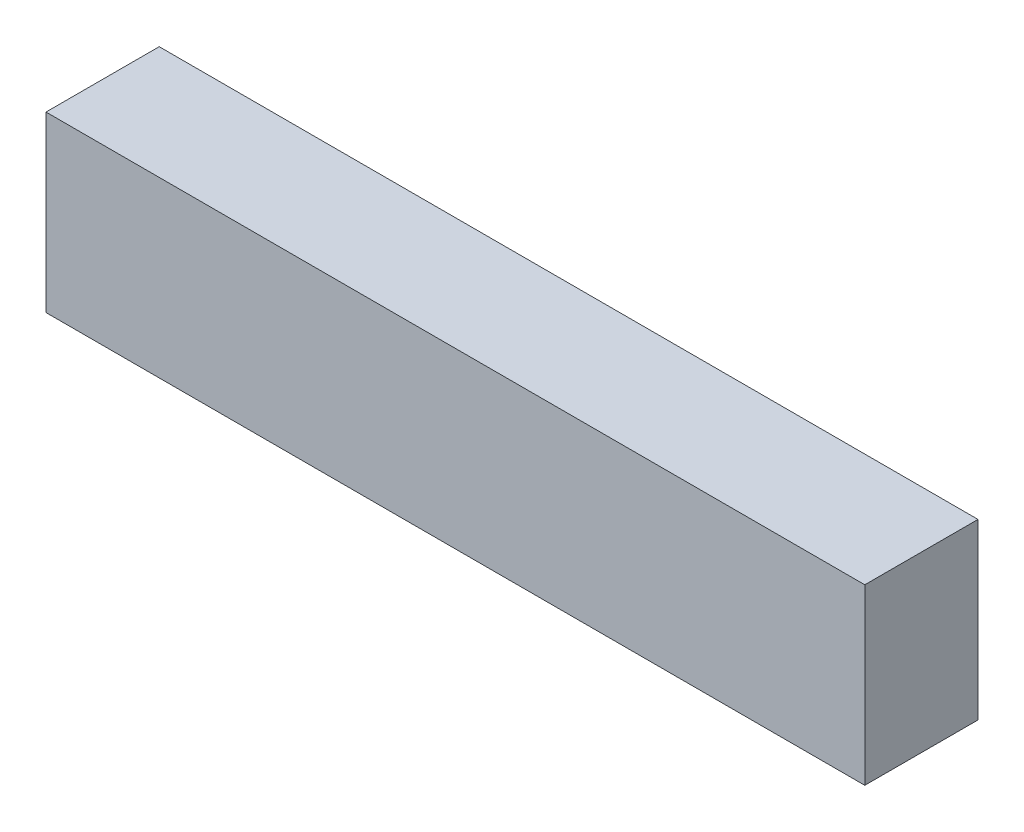
ISO-10303-21;
HEADER;
FILE_DESCRIPTION(('STEP AP214'),'2;1');
FILE_NAME('part.step','',(''),(''),'','','');
FILE_SCHEMA(('AUTOMOTIVE_DESIGN { 1 0 10303 214 1 1 1 1 }'));
ENDSEC;
DATA;
#1=APPLICATION_CONTEXT('core data for automotive mechanical design processes');
#2=APPLICATION_PROTOCOL_DEFINITION('international standard','automotive_design',2000,#1);
#3=PRODUCT_CONTEXT('',#1,'mechanical');
#4=PRODUCT('Part','Part','',(#3));
#5=PRODUCT_RELATED_PRODUCT_CATEGORY('part','',(#4));
#6=PRODUCT_DEFINITION_FORMATION('','',#4);
#7=PRODUCT_DEFINITION_CONTEXT('part definition',#1,'design');
#8=PRODUCT_DEFINITION('design','',#6,#7);
#9=PRODUCT_DEFINITION_SHAPE('','',#8);
#10=(LENGTH_UNIT() NAMED_UNIT(*) SI_UNIT(.MILLI.,.METRE.));
#11=(NAMED_UNIT(*) PLANE_ANGLE_UNIT() SI_UNIT($,.RADIAN.));
#12=(NAMED_UNIT(*) SI_UNIT($,.STERADIAN.) SOLID_ANGLE_UNIT());
#13=UNCERTAINTY_MEASURE_WITH_UNIT(LENGTH_MEASURE(1.E-05),#10,'distance_accuracy_value','');
#14=(GEOMETRIC_REPRESENTATION_CONTEXT(3) GLOBAL_UNCERTAINTY_ASSIGNED_CONTEXT((#13)) GLOBAL_UNIT_ASSIGNED_CONTEXT((#10,
#11,#12)) REPRESENTATION_CONTEXT('',''));
#15=CARTESIAN_POINT('',(0.,0.,0.));
#16=DIRECTION('',(0.,0.,1.));
#17=DIRECTION('',(1.,0.,0.));
#18=AXIS2_PLACEMENT_3D('',#15,#16,#17);
#19=CARTESIAN_POINT('',(0.,0.,85.));
#20=DIRECTION('',(0.,0.,1.));
#21=DIRECTION('',(1.,0.,0.));
#22=AXIS2_PLACEMENT_3D('',#19,#20,#21);
#23=PLANE('',#22);
#24=DIRECTION('',(-1.,0.,0.));
#25=VECTOR('',#24,1.);
#26=CARTESIAN_POINT('',(0.,-56.,85.));
#27=LINE('',#26,#25);
#28=CARTESIAN_POINT('',(264.,-56.,85.));
#29=VERTEX_POINT('',#28);
#30=CARTESIAN_POINT('',(-264.,-56.,85.));
#31=VERTEX_POINT('',#30);
#32=EDGE_CURVE('E11',#29,#31,#27,.T.);
#33=ORIENTED_EDGE('',*,*,#32,.F.);
#34=DIRECTION('',(0.,-1.,0.));
#35=VECTOR('',#34,1.);
#36=CARTESIAN_POINT('',(264.,0.,85.));
#37=LINE('',#36,#35);
#38=CARTESIAN_POINT('',(264.,56.,85.));
#39=VERTEX_POINT('',#38);
#40=EDGE_CURVE('E62',#39,#29,#37,.T.);
#41=ORIENTED_EDGE('',*,*,#40,.F.);
#42=DIRECTION('',(1.,0.,0.));
#43=VECTOR('',#42,1.);
#44=CARTESIAN_POINT('',(0.,56.,85.));
#45=LINE('',#44,#43);
#46=CARTESIAN_POINT('',(-264.,56.,85.));
#47=VERTEX_POINT('',#46);
#48=EDGE_CURVE('E99',#47,#39,#45,.T.);
#49=ORIENTED_EDGE('',*,*,#48,.F.);
#50=DIRECTION('',(0.,1.,0.));
#51=VECTOR('',#50,1.);
#52=CARTESIAN_POINT('',(-264.,0.,85.));
#53=LINE('',#52,#51);
#54=EDGE_CURVE('E25',#31,#47,#53,.T.);
#55=ORIENTED_EDGE('',*,*,#54,.F.);
#56=EDGE_LOOP('',(#33,#41,#49,#55));
#57=FACE_BOUND('',#56,.T.);
#58=ADVANCED_FACE('F17',(#57),#23,.T.);
#59=CARTESIAN_POINT('',(0.,-56.,12.));
#60=DIRECTION('',(0.,-1.,0.));
#61=DIRECTION('',(0.,0.,-1.));
#62=AXIS2_PLACEMENT_3D('',#59,#60,#61);
#63=PLANE('',#62);
#64=DIRECTION('',(0.,0.,1.));
#65=VECTOR('',#64,1.);
#66=CARTESIAN_POINT('',(264.,-56.,12.));
#67=LINE('',#66,#65);
#68=CARTESIAN_POINT('',(264.,-56.,12.));
#69=VERTEX_POINT('',#68);
#70=EDGE_CURVE('E55',#69,#29,#67,.T.);
#71=ORIENTED_EDGE('',*,*,#70,.T.);
#72=ORIENTED_EDGE('',*,*,#32,.T.);
#73=DIRECTION('',(0.,0.,1.));
#74=VECTOR('',#73,1.);
#75=CARTESIAN_POINT('',(-264.,-56.,12.));
#76=LINE('',#75,#74);
#77=CARTESIAN_POINT('',(-264.,-56.,12.));
#78=VERTEX_POINT('',#77);
#79=EDGE_CURVE('E69',#78,#31,#76,.T.);
#80=ORIENTED_EDGE('',*,*,#79,.F.);
#81=DIRECTION('',(1.,0.,0.));
#82=VECTOR('',#81,1.);
#83=CARTESIAN_POINT('',(0.,-56.,12.));
#84=LINE('',#83,#82);
#85=EDGE_CURVE('E67',#78,#69,#84,.T.);
#86=ORIENTED_EDGE('',*,*,#85,.T.);
#87=EDGE_LOOP('',(#71,#72,#80,#86));
#88=FACE_BOUND('',#87,.T.);
#89=ADVANCED_FACE('F68',(#88),#63,.T.);
#90=CARTESIAN_POINT('',(-264.,0.,12.));
#91=DIRECTION('',(-1.,0.,0.));
#92=DIRECTION('',(0.,0.,1.));
#93=AXIS2_PLACEMENT_3D('',#90,#91,#92);
#94=PLANE('',#93);
#95=ORIENTED_EDGE('',*,*,#79,.T.);
#96=ORIENTED_EDGE('',*,*,#54,.T.);
#97=DIRECTION('',(0.,0.,1.));
#98=VECTOR('',#97,1.);
#99=CARTESIAN_POINT('',(-264.,56.,12.));
#100=LINE('',#99,#98);
#101=CARTESIAN_POINT('',(-264.,56.,12.));
#102=VERTEX_POINT('',#101);
#103=EDGE_CURVE('E91',#102,#47,#100,.T.);
#104=ORIENTED_EDGE('',*,*,#103,.F.);
#105=DIRECTION('',(0.,-1.,0.));
#106=VECTOR('',#105,1.);
#107=CARTESIAN_POINT('',(-264.,0.,12.));
#108=LINE('',#107,#106);
#109=EDGE_CURVE('E74',#102,#78,#108,.T.);
#110=ORIENTED_EDGE('',*,*,#109,.T.);
#111=EDGE_LOOP('',(#95,#96,#104,#110));
#112=FACE_BOUND('',#111,.T.);
#113=ADVANCED_FACE('F106',(#112),#94,.T.);
#114=CARTESIAN_POINT('',(0.,56.,12.));
#115=DIRECTION('',(0.,1.,0.));
#116=DIRECTION('',(0.,0.,1.));
#117=AXIS2_PLACEMENT_3D('',#114,#115,#116);
#118=PLANE('',#117);
#119=ORIENTED_EDGE('',*,*,#103,.T.);
#120=ORIENTED_EDGE('',*,*,#48,.T.);
#121=DIRECTION('',(0.,0.,1.));
#122=VECTOR('',#121,1.);
#123=CARTESIAN_POINT('',(264.,56.,12.));
#124=LINE('',#123,#122);
#125=CARTESIAN_POINT('',(264.,56.,12.));
#126=VERTEX_POINT('',#125);
#127=EDGE_CURVE('E64',#126,#39,#124,.T.);
#128=ORIENTED_EDGE('',*,*,#127,.F.);
#129=DIRECTION('',(-1.,0.,0.));
#130=VECTOR('',#129,1.);
#131=CARTESIAN_POINT('',(0.,56.,12.));
#132=LINE('',#131,#130);
#133=EDGE_CURVE('E79',#126,#102,#132,.T.);
#134=ORIENTED_EDGE('',*,*,#133,.T.);
#135=EDGE_LOOP('',(#119,#120,#128,#134));
#136=FACE_BOUND('',#135,.T.);
#137=ADVANCED_FACE('F104',(#136),#118,.T.);
#138=CARTESIAN_POINT('',(0.,0.,12.));
#139=DIRECTION('',(0.,0.,-1.));
#140=DIRECTION('',(-1.,0.,0.));
#141=AXIS2_PLACEMENT_3D('',#138,#139,#140);
#142=PLANE('',#141);
#143=DIRECTION('',(0.,1.,0.));
#144=VECTOR('',#143,1.);
#145=CARTESIAN_POINT('',(264.,0.,12.));
#146=LINE('',#145,#144);
#147=EDGE_CURVE('E60',#69,#126,#146,.T.);
#148=ORIENTED_EDGE('',*,*,#147,.F.);
#149=ORIENTED_EDGE('',*,*,#85,.F.);
#150=ORIENTED_EDGE('',*,*,#109,.F.);
#151=ORIENTED_EDGE('',*,*,#133,.F.);
#152=EDGE_LOOP('',(#148,#149,#150,#151));
#153=FACE_BOUND('',#152,.T.);
#154=ADVANCED_FACE('F77',(#153),#142,.T.);
#155=CARTESIAN_POINT('',(264.,0.,12.));
#156=DIRECTION('',(1.,0.,0.));
#157=DIRECTION('',(0.,0.,-1.));
#158=AXIS2_PLACEMENT_3D('',#155,#156,#157);
#159=PLANE('',#158);
#160=ORIENTED_EDGE('',*,*,#147,.T.);
#161=ORIENTED_EDGE('',*,*,#127,.T.);
#162=ORIENTED_EDGE('',*,*,#40,.T.);
#163=ORIENTED_EDGE('',*,*,#70,.F.);
#164=EDGE_LOOP('',(#160,#161,#162,#163));
#165=FACE_BOUND('',#164,.T.);
#166=ADVANCED_FACE('F57',(#165),#159,.T.);
#167=CLOSED_SHELL('',(#58,#89,#113,#137,#154,#166));
#168=MANIFOLD_SOLID_BREP('B1',#167);
#169=ADVANCED_BREP_SHAPE_REPRESENTATION('',(#18,#168),#14);
#170=SHAPE_DEFINITION_REPRESENTATION(#9,#169);
ENDSEC;
END-ISO-10303-21;
